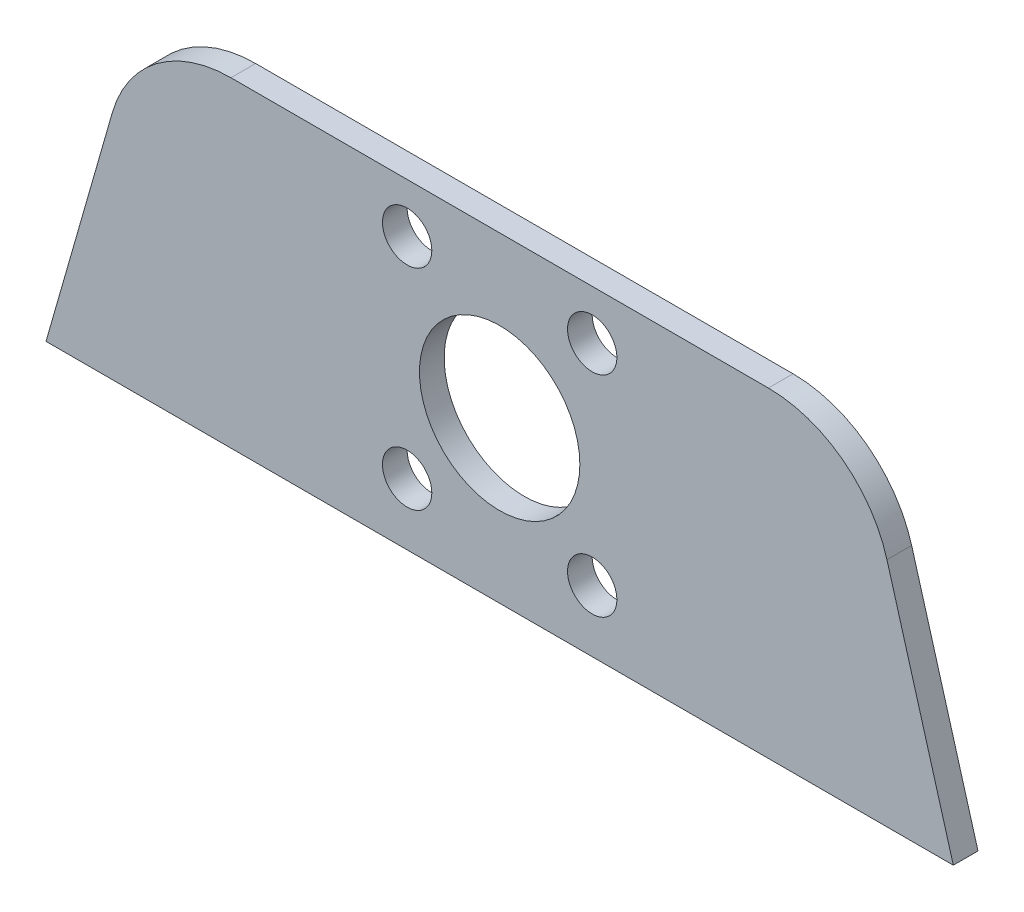
ISO-10303-21;
HEADER;
FILE_DESCRIPTION(('STEP AP214'),'2;1');
FILE_NAME('part.step','',(''),(''),'','','');
FILE_SCHEMA(('AUTOMOTIVE_DESIGN { 1 0 10303 214 1 1 1 1 }'));
ENDSEC;
DATA;
#1=APPLICATION_CONTEXT('core data for automotive mechanical design processes');
#2=APPLICATION_PROTOCOL_DEFINITION('international standard','automotive_design',2000,#1);
#3=PRODUCT_CONTEXT('',#1,'mechanical');
#4=PRODUCT('Part','Part','',(#3));
#5=PRODUCT_RELATED_PRODUCT_CATEGORY('part','',(#4));
#6=PRODUCT_DEFINITION_FORMATION('','',#4);
#7=PRODUCT_DEFINITION_CONTEXT('part definition',#1,'design');
#8=PRODUCT_DEFINITION('design','',#6,#7);
#9=PRODUCT_DEFINITION_SHAPE('','',#8);
#10=(LENGTH_UNIT() NAMED_UNIT(*) SI_UNIT(.MILLI.,.METRE.));
#11=(NAMED_UNIT(*) PLANE_ANGLE_UNIT() SI_UNIT($,.RADIAN.));
#12=(NAMED_UNIT(*) SI_UNIT($,.STERADIAN.) SOLID_ANGLE_UNIT());
#13=UNCERTAINTY_MEASURE_WITH_UNIT(LENGTH_MEASURE(1.E-05),#10,'distance_accuracy_value','');
#14=(GEOMETRIC_REPRESENTATION_CONTEXT(3) GLOBAL_UNCERTAINTY_ASSIGNED_CONTEXT((#13)) GLOBAL_UNIT_ASSIGNED_CONTEXT((#10,
#11,#12)) REPRESENTATION_CONTEXT('',''));
#15=CARTESIAN_POINT('',(0.,0.,0.));
#16=DIRECTION('',(0.,0.,1.));
#17=DIRECTION('',(1.,0.,0.));
#18=AXIS2_PLACEMENT_3D('',#15,#16,#17);
#19=CARTESIAN_POINT('',(0.,0.,2.));
#20=DIRECTION('',(0.,0.,1.));
#21=DIRECTION('',(1.,0.,0.));
#22=AXIS2_PLACEMENT_3D('',#19,#20,#21);
#23=PLANE('',#22);
#24=CARTESIAN_POINT('',(0.,0.,2.));
#25=DIRECTION('',(0.,0.,1.));
#26=DIRECTION('',(1.,0.,0.));
#27=AXIS2_PLACEMENT_3D('',#24,#25,#26);
#28=CIRCLE('',#27,2.);
#29=CARTESIAN_POINT('',(2.,0.,2.));
#30=VERTEX_POINT('',#29);
#31=EDGE_CURVE('E165',#30,#30,#28,.T.);
#32=ORIENTED_EDGE('',*,*,#31,.F.);
#33=EDGE_LOOP('',(#32));
#34=FACE_BOUND('',#33,.T.);
#35=CARTESIAN_POINT('',(15.,0.,2.));
#36=DIRECTION('',(0.,0.,1.));
#37=DIRECTION('',(1.,0.,0.));
#38=AXIS2_PLACEMENT_3D('',#35,#36,#37);
#39=CIRCLE('',#38,2.);
#40=CARTESIAN_POINT('',(17.,0.,2.));
#41=VERTEX_POINT('',#40);
#42=EDGE_CURVE('E153',#41,#41,#39,.T.);
#43=ORIENTED_EDGE('',*,*,#42,.F.);
#44=EDGE_LOOP('',(#43));
#45=FACE_BOUND('',#44,.T.);
#46=DIRECTION('',(-0.275637355817003,0.961261695938318,0.));
#47=VECTOR('',#46,1.);
#48=CARTESIAN_POINT('',(36.813954207879,21.,2.));
#49=LINE('',#48,#47);
#50=CARTESIAN_POINT('',(44.2693342376081,-4.99999999999999,2.));
#51=VERTEX_POINT('',#50);
#52=CARTESIAN_POINT('',(38.8910306662343,13.75637355817,2.));
#53=VERTEX_POINT('',#52);
#54=EDGE_CURVE('E123',#51,#53,#49,.T.);
#55=ORIENTED_EDGE('',*,*,#54,.T.);
#56=CARTESIAN_POINT('',(29.2784137068511,11.,2.));
#57=DIRECTION('',(0.,0.,1.));
#58=DIRECTION('',(1.,0.,0.));
#59=AXIS2_PLACEMENT_3D('',#56,#57,#58);
#60=CIRCLE('',#59,10.);
#61=CARTESIAN_POINT('',(29.2784137068511,21.,2.));
#62=VERTEX_POINT('',#61);
#63=EDGE_CURVE('E44',#53,#62,#60,.T.);
#64=ORIENTED_EDGE('',*,*,#63,.T.);
#65=DIRECTION('',(-1.,0.,0.));
#66=VECTOR('',#65,1.);
#67=CARTESIAN_POINT('',(-21.813954207879,21.,2.));
#68=LINE('',#67,#66);
#69=CARTESIAN_POINT('',(-14.2784137068511,21.,2.));
#70=VERTEX_POINT('',#69);
#71=EDGE_CURVE('E97',#62,#70,#68,.T.);
#72=ORIENTED_EDGE('',*,*,#71,.T.);
#73=CARTESIAN_POINT('',(-14.2784137068511,11.,2.));
#74=DIRECTION('',(0.,0.,1.));
#75=DIRECTION('',(1.,0.,0.));
#76=AXIS2_PLACEMENT_3D('',#73,#74,#75);
#77=CIRCLE('',#76,10.);
#78=CARTESIAN_POINT('',(-23.8910306662343,13.75637355817,2.));
#79=VERTEX_POINT('',#78);
#80=EDGE_CURVE('E51',#70,#79,#77,.T.);
#81=ORIENTED_EDGE('',*,*,#80,.T.);
#82=DIRECTION('',(-0.275637355817003,-0.961261695938318,0.));
#83=VECTOR('',#82,1.);
#84=CARTESIAN_POINT('',(-21.813954207879,21.,2.));
#85=LINE('',#84,#83);
#86=CARTESIAN_POINT('',(-29.2693342376081,-5.,2.));
#87=VERTEX_POINT('',#86);
#88=EDGE_CURVE('E89',#79,#87,#85,.T.);
#89=ORIENTED_EDGE('',*,*,#88,.T.);
#90=DIRECTION('',(1.,0.,0.));
#91=VECTOR('',#90,1.);
#92=CARTESIAN_POINT('',(-29.2693342376081,-5.,2.));
#93=LINE('',#92,#91);
#94=EDGE_CURVE('E93',#87,#51,#93,.T.);
#95=ORIENTED_EDGE('',*,*,#94,.T.);
#96=EDGE_LOOP('',(#55,#64,#72,#81,#89,#95));
#97=FACE_BOUND('',#96,.T.);
#98=CARTESIAN_POINT('',(15.,17.,2.));
#99=DIRECTION('',(0.,0.,1.));
#100=DIRECTION('',(1.,0.,0.));
#101=AXIS2_PLACEMENT_3D('',#98,#99,#100);
#102=CIRCLE('',#101,2.);
#103=CARTESIAN_POINT('',(17.,17.,2.));
#104=VERTEX_POINT('',#103);
#105=EDGE_CURVE('E118',#104,#104,#102,.T.);
#106=ORIENTED_EDGE('',*,*,#105,.F.);
#107=EDGE_LOOP('',(#106));
#108=FACE_BOUND('',#107,.T.);
#109=CARTESIAN_POINT('',(0.,17.,2.));
#110=DIRECTION('',(0.,0.,1.));
#111=DIRECTION('',(1.,0.,0.));
#112=AXIS2_PLACEMENT_3D('',#109,#110,#111);
#113=CIRCLE('',#112,2.);
#114=CARTESIAN_POINT('',(2.,17.,2.));
#115=VERTEX_POINT('',#114);
#116=EDGE_CURVE('E159',#115,#115,#113,.T.);
#117=ORIENTED_EDGE('',*,*,#116,.F.);
#118=EDGE_LOOP('',(#117));
#119=FACE_BOUND('',#118,.T.);
#120=CARTESIAN_POINT('',(7.5,8.,2.));
#121=DIRECTION('',(0.,0.,1.));
#122=DIRECTION('',(1.,0.,0.));
#123=AXIS2_PLACEMENT_3D('',#120,#121,#122);
#124=CIRCLE('',#123,6.5);
#125=CARTESIAN_POINT('',(14.,8.,2.));
#126=VERTEX_POINT('',#125);
#127=EDGE_CURVE('E171',#126,#126,#124,.T.);
#128=ORIENTED_EDGE('',*,*,#127,.F.);
#129=EDGE_LOOP('',(#128));
#130=FACE_BOUND('',#129,.T.);
#131=ADVANCED_FACE('F36',(#34,#45,#97,#108,#119,#130),#23,.T.);
#132=CARTESIAN_POINT('',(0.,0.,0.));
#133=DIRECTION('',(0.,0.,1.));
#134=DIRECTION('',(1.,0.,0.));
#135=AXIS2_PLACEMENT_3D('',#132,#133,#134);
#136=PLANE('',#135);
#137=DIRECTION('',(-1.,0.,0.));
#138=VECTOR('',#137,1.);
#139=CARTESIAN_POINT('',(-21.813954207879,21.,0.));
#140=LINE('',#139,#138);
#141=CARTESIAN_POINT('',(29.2784137068511,21.,0.));
#142=VERTEX_POINT('',#141);
#143=CARTESIAN_POINT('',(-14.2784137068511,21.,0.));
#144=VERTEX_POINT('',#143);
#145=EDGE_CURVE('E117',#142,#144,#140,.T.);
#146=ORIENTED_EDGE('',*,*,#145,.F.);
#147=CARTESIAN_POINT('',(29.2784137068511,11.,0.));
#148=DIRECTION('',(0.,0.,1.));
#149=DIRECTION('',(1.,0.,0.));
#150=AXIS2_PLACEMENT_3D('',#147,#148,#149);
#151=CIRCLE('',#150,10.);
#152=CARTESIAN_POINT('',(38.8910306662343,13.75637355817,0.));
#153=VERTEX_POINT('',#152);
#154=EDGE_CURVE('E131',#142,#153,#151,.F.);
#155=ORIENTED_EDGE('',*,*,#154,.T.);
#156=DIRECTION('',(-0.275637355817003,0.961261695938318,0.));
#157=VECTOR('',#156,1.);
#158=CARTESIAN_POINT('',(36.813954207879,21.,0.));
#159=LINE('',#158,#157);
#160=CARTESIAN_POINT('',(44.2693342376081,-4.99999999999999,0.));
#161=VERTEX_POINT('',#160);
#162=EDGE_CURVE('E115',#161,#153,#159,.T.);
#163=ORIENTED_EDGE('',*,*,#162,.F.);
#164=DIRECTION('',(1.,0.,0.));
#165=VECTOR('',#164,1.);
#166=CARTESIAN_POINT('',(-29.2693342376081,-5.,0.));
#167=LINE('',#166,#165);
#168=CARTESIAN_POINT('',(-29.2693342376081,-5.,0.));
#169=VERTEX_POINT('',#168);
#170=EDGE_CURVE('E122',#169,#161,#167,.T.);
#171=ORIENTED_EDGE('',*,*,#170,.F.);
#172=DIRECTION('',(-0.275637355817003,-0.961261695938318,0.));
#173=VECTOR('',#172,1.);
#174=CARTESIAN_POINT('',(-21.813954207879,21.,0.));
#175=LINE('',#174,#173);
#176=CARTESIAN_POINT('',(-23.8910306662343,13.75637355817,0.));
#177=VERTEX_POINT('',#176);
#178=EDGE_CURVE('E103',#177,#169,#175,.T.);
#179=ORIENTED_EDGE('',*,*,#178,.F.);
#180=CARTESIAN_POINT('',(-14.2784137068511,11.,0.));
#181=DIRECTION('',(0.,0.,1.));
#182=DIRECTION('',(1.,0.,0.));
#183=AXIS2_PLACEMENT_3D('',#180,#181,#182);
#184=CIRCLE('',#183,10.);
#185=EDGE_CURVE('E129',#177,#144,#184,.F.);
#186=ORIENTED_EDGE('',*,*,#185,.T.);
#187=EDGE_LOOP('',(#146,#155,#163,#171,#179,#186));
#188=FACE_BOUND('',#187,.T.);
#189=CARTESIAN_POINT('',(15.,17.,0.));
#190=DIRECTION('',(0.,0.,1.));
#191=DIRECTION('',(1.,0.,0.));
#192=AXIS2_PLACEMENT_3D('',#189,#190,#191);
#193=CIRCLE('',#192,2.);
#194=CARTESIAN_POINT('',(17.,17.,0.));
#195=VERTEX_POINT('',#194);
#196=EDGE_CURVE('E150',#195,#195,#193,.T.);
#197=ORIENTED_EDGE('',*,*,#196,.T.);
#198=EDGE_LOOP('',(#197));
#199=FACE_BOUND('',#198,.T.);
#200=CARTESIAN_POINT('',(15.,0.,0.));
#201=DIRECTION('',(0.,0.,1.));
#202=DIRECTION('',(1.,0.,0.));
#203=AXIS2_PLACEMENT_3D('',#200,#201,#202);
#204=CIRCLE('',#203,2.);
#205=CARTESIAN_POINT('',(17.,0.,0.));
#206=VERTEX_POINT('',#205);
#207=EDGE_CURVE('E156',#206,#206,#204,.T.);
#208=ORIENTED_EDGE('',*,*,#207,.T.);
#209=EDGE_LOOP('',(#208));
#210=FACE_BOUND('',#209,.T.);
#211=CARTESIAN_POINT('',(0.,17.,0.));
#212=DIRECTION('',(0.,0.,1.));
#213=DIRECTION('',(1.,0.,0.));
#214=AXIS2_PLACEMENT_3D('',#211,#212,#213);
#215=CIRCLE('',#214,2.);
#216=CARTESIAN_POINT('',(2.,17.,0.));
#217=VERTEX_POINT('',#216);
#218=EDGE_CURVE('E162',#217,#217,#215,.T.);
#219=ORIENTED_EDGE('',*,*,#218,.T.);
#220=EDGE_LOOP('',(#219));
#221=FACE_BOUND('',#220,.T.);
#222=CARTESIAN_POINT('',(0.,0.,0.));
#223=DIRECTION('',(0.,0.,1.));
#224=DIRECTION('',(1.,0.,0.));
#225=AXIS2_PLACEMENT_3D('',#222,#223,#224);
#226=CIRCLE('',#225,2.);
#227=CARTESIAN_POINT('',(2.,0.,0.));
#228=VERTEX_POINT('',#227);
#229=EDGE_CURVE('E168',#228,#228,#226,.T.);
#230=ORIENTED_EDGE('',*,*,#229,.T.);
#231=EDGE_LOOP('',(#230));
#232=FACE_BOUND('',#231,.T.);
#233=CARTESIAN_POINT('',(7.5,8.,0.));
#234=DIRECTION('',(0.,0.,1.));
#235=DIRECTION('',(1.,0.,0.));
#236=AXIS2_PLACEMENT_3D('',#233,#234,#235);
#237=CIRCLE('',#236,6.5);
#238=CARTESIAN_POINT('',(14.,8.,0.));
#239=VERTEX_POINT('',#238);
#240=EDGE_CURVE('E174',#239,#239,#237,.T.);
#241=ORIENTED_EDGE('',*,*,#240,.T.);
#242=EDGE_LOOP('',(#241));
#243=FACE_BOUND('',#242,.T.);
#244=ADVANCED_FACE('F145',(#188,#199,#210,#221,#232,#243),#136,.F.);
#245=CARTESIAN_POINT('',(36.813954207879,21.,2.));
#246=DIRECTION('',(-0.961261695938318,-0.275637355817003,0.));
#247=DIRECTION('',(0.275637355817003,-0.961261695938318,0.));
#248=AXIS2_PLACEMENT_3D('',#245,#246,#247);
#249=PLANE('',#248);
#250=ORIENTED_EDGE('',*,*,#162,.T.);
#251=DIRECTION('',(0.,0.,-1.));
#252=VECTOR('',#251,1.);
#253=CARTESIAN_POINT('',(38.8910306662343,13.75637355817,2.));
#254=LINE('',#253,#252);
#255=EDGE_CURVE('E59',#153,#53,#254,.F.);
#256=ORIENTED_EDGE('',*,*,#255,.T.);
#257=ORIENTED_EDGE('',*,*,#54,.F.);
#258=DIRECTION('',(0.,0.,-1.));
#259=VECTOR('',#258,1.);
#260=CARTESIAN_POINT('',(44.2693342376081,-4.99999999999999,2.));
#261=LINE('',#260,#259);
#262=EDGE_CURVE('E107',#51,#161,#261,.T.);
#263=ORIENTED_EDGE('',*,*,#262,.T.);
#264=EDGE_LOOP('',(#250,#256,#257,#263));
#265=FACE_BOUND('',#264,.T.);
#266=ADVANCED_FACE('F147',(#265),#249,.F.);
#267=CARTESIAN_POINT('',(-21.813954207879,21.,2.));
#268=DIRECTION('',(0.,-1.,0.));
#269=DIRECTION('',(1.,0.,0.));
#270=AXIS2_PLACEMENT_3D('',#267,#268,#269);
#271=PLANE('',#270);
#272=ORIENTED_EDGE('',*,*,#71,.F.);
#273=DIRECTION('',(0.,0.,-1.));
#274=VECTOR('',#273,1.);
#275=CARTESIAN_POINT('',(29.2784137068511,21.,2.));
#276=LINE('',#275,#274);
#277=EDGE_CURVE('E126',#62,#142,#276,.T.);
#278=ORIENTED_EDGE('',*,*,#277,.T.);
#279=ORIENTED_EDGE('',*,*,#145,.T.);
#280=DIRECTION('',(0.,0.,-1.));
#281=VECTOR('',#280,1.);
#282=CARTESIAN_POINT('',(-14.2784137068511,21.,2.));
#283=LINE('',#282,#281);
#284=EDGE_CURVE('E106',#144,#70,#283,.F.);
#285=ORIENTED_EDGE('',*,*,#284,.T.);
#286=EDGE_LOOP('',(#272,#278,#279,#285));
#287=FACE_BOUND('',#286,.T.);
#288=ADVANCED_FACE('F139',(#287),#271,.F.);
#289=CARTESIAN_POINT('',(-21.813954207879,21.,2.));
#290=DIRECTION('',(0.961261695938318,-0.275637355817003,0.));
#291=DIRECTION('',(0.275637355817003,0.961261695938318,0.));
#292=AXIS2_PLACEMENT_3D('',#289,#290,#291);
#293=PLANE('',#292);
#294=ORIENTED_EDGE('',*,*,#88,.F.);
#295=DIRECTION('',(0.,0.,-1.));
#296=VECTOR('',#295,1.);
#297=CARTESIAN_POINT('',(-23.8910306662343,13.75637355817,2.));
#298=LINE('',#297,#296);
#299=EDGE_CURVE('E11',#79,#177,#298,.T.);
#300=ORIENTED_EDGE('',*,*,#299,.T.);
#301=ORIENTED_EDGE('',*,*,#178,.T.);
#302=DIRECTION('',(0.,0.,-1.));
#303=VECTOR('',#302,1.);
#304=CARTESIAN_POINT('',(-29.2693342376081,-5.,2.));
#305=LINE('',#304,#303);
#306=EDGE_CURVE('E100',#87,#169,#305,.T.);
#307=ORIENTED_EDGE('',*,*,#306,.F.);
#308=EDGE_LOOP('',(#294,#300,#301,#307));
#309=FACE_BOUND('',#308,.T.);
#310=ADVANCED_FACE('F101',(#309),#293,.F.);
#311=CARTESIAN_POINT('',(-29.2693342376081,-5.,2.));
#312=DIRECTION('',(0.,1.,0.));
#313=DIRECTION('',(-1.,0.,0.));
#314=AXIS2_PLACEMENT_3D('',#311,#312,#313);
#315=PLANE('',#314);
#316=ORIENTED_EDGE('',*,*,#170,.T.);
#317=ORIENTED_EDGE('',*,*,#262,.F.);
#318=ORIENTED_EDGE('',*,*,#94,.F.);
#319=ORIENTED_EDGE('',*,*,#306,.T.);
#320=EDGE_LOOP('',(#316,#317,#318,#319));
#321=FACE_BOUND('',#320,.T.);
#322=ADVANCED_FACE('F109',(#321),#315,.F.);
#323=CARTESIAN_POINT('',(15.,17.,2.));
#324=DIRECTION('',(0.,0.,-1.));
#325=DIRECTION('',(-1.,0.,0.));
#326=AXIS2_PLACEMENT_3D('',#323,#324,#325);
#327=CYLINDRICAL_SURFACE('',#326,2.);
#328=ORIENTED_EDGE('',*,*,#105,.T.);
#329=EDGE_LOOP('',(#328));
#330=FACE_BOUND('',#329,.T.);
#331=ORIENTED_EDGE('',*,*,#196,.F.);
#332=EDGE_LOOP('',(#331));
#333=FACE_BOUND('',#332,.T.);
#334=ADVANCED_FACE('F193',(#330,#333),#327,.F.);
#335=CARTESIAN_POINT('',(15.,0.,2.));
#336=DIRECTION('',(0.,0.,-1.));
#337=DIRECTION('',(-1.,0.,0.));
#338=AXIS2_PLACEMENT_3D('',#335,#336,#337);
#339=CYLINDRICAL_SURFACE('',#338,2.);
#340=ORIENTED_EDGE('',*,*,#42,.T.);
#341=EDGE_LOOP('',(#340));
#342=FACE_BOUND('',#341,.T.);
#343=ORIENTED_EDGE('',*,*,#207,.F.);
#344=EDGE_LOOP('',(#343));
#345=FACE_BOUND('',#344,.T.);
#346=ADVANCED_FACE('F219',(#342,#345),#339,.F.);
#347=CARTESIAN_POINT('',(0.,17.,2.));
#348=DIRECTION('',(0.,0.,-1.));
#349=DIRECTION('',(-1.,0.,0.));
#350=AXIS2_PLACEMENT_3D('',#347,#348,#349);
#351=CYLINDRICAL_SURFACE('',#350,2.);
#352=ORIENTED_EDGE('',*,*,#116,.T.);
#353=EDGE_LOOP('',(#352));
#354=FACE_BOUND('',#353,.T.);
#355=ORIENTED_EDGE('',*,*,#218,.F.);
#356=EDGE_LOOP('',(#355));
#357=FACE_BOUND('',#356,.T.);
#358=ADVANCED_FACE('F214',(#354,#357),#351,.F.);
#359=CARTESIAN_POINT('',(0.,0.,2.));
#360=DIRECTION('',(0.,0.,-1.));
#361=DIRECTION('',(-1.,0.,0.));
#362=AXIS2_PLACEMENT_3D('',#359,#360,#361);
#363=CYLINDRICAL_SURFACE('',#362,2.);
#364=ORIENTED_EDGE('',*,*,#31,.T.);
#365=EDGE_LOOP('',(#364));
#366=FACE_BOUND('',#365,.T.);
#367=ORIENTED_EDGE('',*,*,#229,.F.);
#368=EDGE_LOOP('',(#367));
#369=FACE_BOUND('',#368,.T.);
#370=ADVANCED_FACE('F209',(#366,#369),#363,.F.);
#371=CARTESIAN_POINT('',(7.5,8.,2.));
#372=DIRECTION('',(0.,0.,-1.));
#373=DIRECTION('',(-1.,0.,0.));
#374=AXIS2_PLACEMENT_3D('',#371,#372,#373);
#375=CYLINDRICAL_SURFACE('',#374,6.5);
#376=ORIENTED_EDGE('',*,*,#127,.T.);
#377=EDGE_LOOP('',(#376));
#378=FACE_BOUND('',#377,.T.);
#379=ORIENTED_EDGE('',*,*,#240,.F.);
#380=EDGE_LOOP('',(#379));
#381=FACE_BOUND('',#380,.T.);
#382=ADVANCED_FACE('F180',(#378,#381),#375,.F.);
#383=CARTESIAN_POINT('',(29.2784137068511,11.,2.));
#384=DIRECTION('',(0.,0.,-1.));
#385=DIRECTION('',(-1.,0.,0.));
#386=AXIS2_PLACEMENT_3D('',#383,#384,#385);
#387=CYLINDRICAL_SURFACE('',#386,10.);
#388=ORIENTED_EDGE('',*,*,#63,.F.);
#389=ORIENTED_EDGE('',*,*,#255,.F.);
#390=ORIENTED_EDGE('',*,*,#154,.F.);
#391=ORIENTED_EDGE('',*,*,#277,.F.);
#392=EDGE_LOOP('',(#388,#389,#390,#391));
#393=FACE_BOUND('',#392,.T.);
#394=ADVANCED_FACE('F142',(#393),#387,.T.);
#395=CARTESIAN_POINT('',(-14.2784137068511,11.,2.));
#396=DIRECTION('',(0.,0.,-1.));
#397=DIRECTION('',(-1.,0.,0.));
#398=AXIS2_PLACEMENT_3D('',#395,#396,#397);
#399=CYLINDRICAL_SURFACE('',#398,10.);
#400=ORIENTED_EDGE('',*,*,#80,.F.);
#401=ORIENTED_EDGE('',*,*,#284,.F.);
#402=ORIENTED_EDGE('',*,*,#185,.F.);
#403=ORIENTED_EDGE('',*,*,#299,.F.);
#404=EDGE_LOOP('',(#400,#401,#402,#403));
#405=FACE_BOUND('',#404,.T.);
#406=ADVANCED_FACE('F38',(#405),#399,.T.);
#407=CLOSED_SHELL('',(#131,#244,#266,#288,#310,#322,#334,#346,#358,#370,#382,#394,#406));
#408=MANIFOLD_SOLID_BREP('B2',#407);
#409=ADVANCED_BREP_SHAPE_REPRESENTATION('',(#18,#408),#14);
#410=SHAPE_DEFINITION_REPRESENTATION(#9,#409);
ENDSEC;
END-ISO-10303-21;
